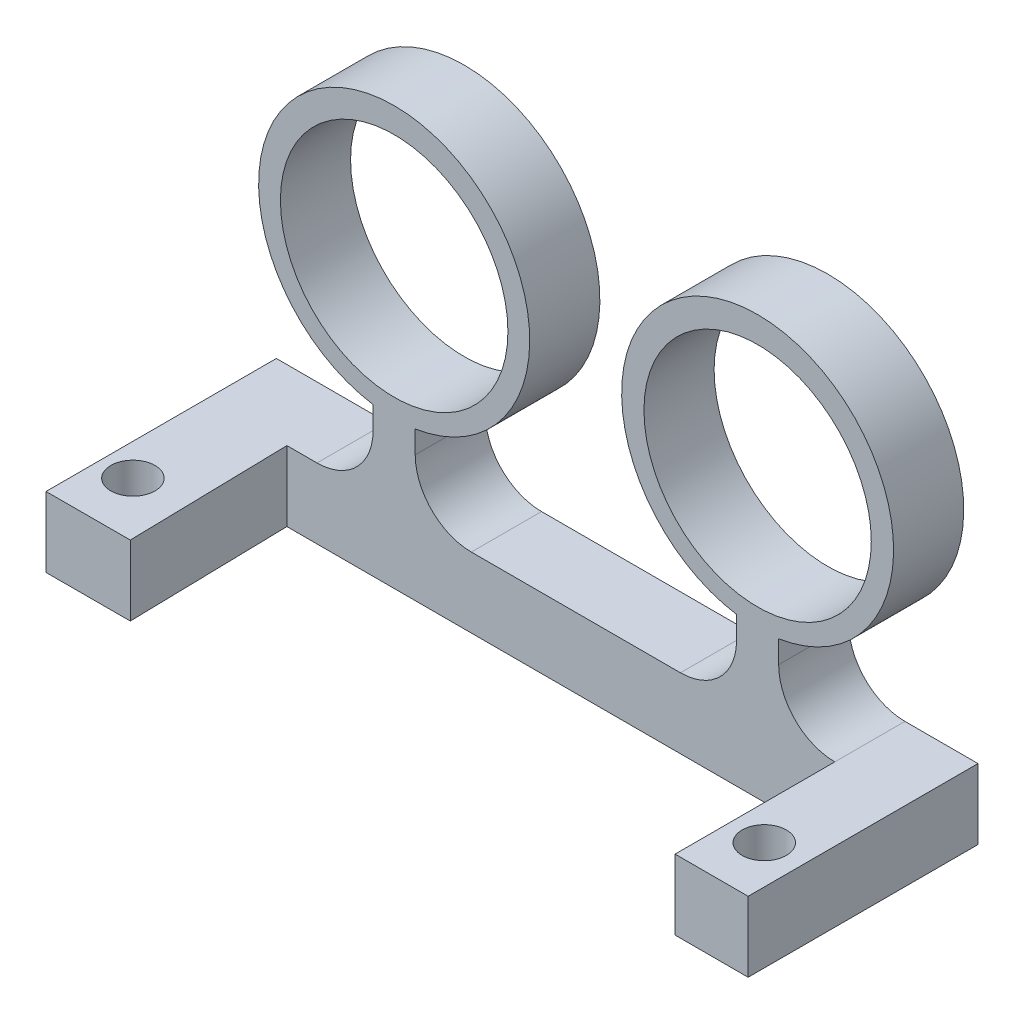
ISO-10303-21;
HEADER;
FILE_DESCRIPTION(('STEP AP214'),'2;1');
FILE_NAME('part.step','',(''),(''),'','','');
FILE_SCHEMA(('AUTOMOTIVE_DESIGN { 1 0 10303 214 1 1 1 1 }'));
ENDSEC;
DATA;
#1=APPLICATION_CONTEXT('core data for automotive mechanical design processes');
#2=APPLICATION_PROTOCOL_DEFINITION('international standard','automotive_design',2000,#1);
#3=PRODUCT_CONTEXT('',#1,'mechanical');
#4=PRODUCT('Part','Part','',(#3));
#5=PRODUCT_RELATED_PRODUCT_CATEGORY('part','',(#4));
#6=PRODUCT_DEFINITION_FORMATION('','',#4);
#7=PRODUCT_DEFINITION_CONTEXT('part definition',#1,'design');
#8=PRODUCT_DEFINITION('design','',#6,#7);
#9=PRODUCT_DEFINITION_SHAPE('','',#8);
#10=(LENGTH_UNIT() NAMED_UNIT(*) SI_UNIT(.MILLI.,.METRE.));
#11=(NAMED_UNIT(*) PLANE_ANGLE_UNIT() SI_UNIT($,.RADIAN.));
#12=(NAMED_UNIT(*) SI_UNIT($,.STERADIAN.) SOLID_ANGLE_UNIT());
#13=UNCERTAINTY_MEASURE_WITH_UNIT(LENGTH_MEASURE(1.E-05),#10,'distance_accuracy_value','');
#14=(GEOMETRIC_REPRESENTATION_CONTEXT(3) GLOBAL_UNCERTAINTY_ASSIGNED_CONTEXT((#13)) GLOBAL_UNIT_ASSIGNED_CONTEXT((#10,
#11,#12)) REPRESENTATION_CONTEXT('',''));
#15=CARTESIAN_POINT('',(0.,0.,0.));
#16=DIRECTION('',(0.,0.,1.));
#17=DIRECTION('',(1.,0.,0.));
#18=AXIS2_PLACEMENT_3D('',#15,#16,#17);
#19=CARTESIAN_POINT('',(13.3947315880938,20.1428791681746,5.));
#20=DIRECTION('',(0.,0.,-1.));
#21=DIRECTION('',(-1.,0.,0.));
#22=AXIS2_PLACEMENT_3D('',#19,#20,#21);
#23=PLANE('',#22);
#24=DIRECTION('',(1.,0.,0.));
#25=VECTOR('',#24,1.);
#26=CARTESIAN_POINT('',(0.,0.,5.));
#27=LINE('',#26,#25);
#28=CARTESIAN_POINT('',(5.75200352373025,0.,5.));
#29=VERTEX_POINT('',#28);
#30=CARTESIAN_POINT('',(44.7947315880938,0.,5.));
#31=VERTEX_POINT('',#30);
#32=EDGE_CURVE('E52',#29,#31,#27,.T.);
#33=ORIENTED_EDGE('',*,*,#32,.T.);
#34=DIRECTION('',(0.,1.,0.));
#35=VECTOR('',#34,1.);
#36=CARTESIAN_POINT('',(44.7947315880938,20.1428791681746,5.));
#37=LINE('',#36,#35);
#38=CARTESIAN_POINT('',(44.7947315880938,5.,5.));
#39=VERTEX_POINT('',#38);
#40=EDGE_CURVE('E201',#31,#39,#37,.T.);
#41=ORIENTED_EDGE('',*,*,#40,.T.);
#42=CARTESIAN_POINT('',(44.7947315880938,9.,5.));
#43=DIRECTION('',(0.,0.,-1.));
#44=DIRECTION('',(-1.,0.,0.));
#45=AXIS2_PLACEMENT_3D('',#42,#43,#44);
#46=CIRCLE('',#45,4.);
#47=CARTESIAN_POINT('',(40.7947315880938,9.,5.));
#48=VERTEX_POINT('',#47);
#49=EDGE_CURVE('E11',#39,#48,#46,.T.);
#50=ORIENTED_EDGE('',*,*,#49,.T.);
#51=DIRECTION('',(0.,1.,0.));
#52=VECTOR('',#51,1.);
#53=CARTESIAN_POINT('',(40.7947315880938,5.,5.));
#54=LINE('',#53,#52);
#55=CARTESIAN_POINT('',(40.7947315880938,10.6,5.));
#56=VERTEX_POINT('',#55);
#57=EDGE_CURVE('E240',#48,#56,#54,.T.);
#58=ORIENTED_EDGE('',*,*,#57,.T.);
#59=CARTESIAN_POINT('',(39.2947315880938,20.1715707020491,5.));
#60=DIRECTION('',(0.,0.,1.));
#61=DIRECTION('',(-1.,0.,0.));
#62=AXIS2_PLACEMENT_3D('',#59,#60,#61);
#63=CIRCLE('',#62,9.68839335);
#64=CARTESIAN_POINT('',(37.7947315880938,10.6,5.));
#65=VERTEX_POINT('',#64);
#66=EDGE_CURVE('E243',#56,#65,#63,.T.);
#67=ORIENTED_EDGE('',*,*,#66,.T.);
#68=DIRECTION('',(0.,-1.,0.));
#69=VECTOR('',#68,1.);
#70=CARTESIAN_POINT('',(37.7947315880938,5.,5.));
#71=LINE('',#70,#69);
#72=CARTESIAN_POINT('',(37.7947315880938,9.,5.));
#73=VERTEX_POINT('',#72);
#74=EDGE_CURVE('E245',#65,#73,#71,.T.);
#75=ORIENTED_EDGE('',*,*,#74,.T.);
#76=CARTESIAN_POINT('',(33.7947315880938,9.,5.));
#77=DIRECTION('',(0.,0.,-1.));
#78=DIRECTION('',(-1.,0.,0.));
#79=AXIS2_PLACEMENT_3D('',#76,#77,#78);
#80=CIRCLE('',#79,4.);
#81=CARTESIAN_POINT('',(33.7947315880938,5.,5.));
#82=VERTEX_POINT('',#81);
#83=EDGE_CURVE('E333',#73,#82,#80,.T.);
#84=ORIENTED_EDGE('',*,*,#83,.T.);
#85=DIRECTION('',(-1.,0.,0.));
#86=VECTOR('',#85,1.);
#87=CARTESIAN_POINT('',(37.7947315880938,5.,5.));
#88=LINE('',#87,#86);
#89=CARTESIAN_POINT('',(18.8947315880938,5.,5.));
#90=VERTEX_POINT('',#89);
#91=EDGE_CURVE('E248',#82,#90,#88,.T.);
#92=ORIENTED_EDGE('',*,*,#91,.T.);
#93=CARTESIAN_POINT('',(18.8947315880938,9.,5.));
#94=DIRECTION('',(0.,0.,-1.));
#95=DIRECTION('',(-1.,0.,0.));
#96=AXIS2_PLACEMENT_3D('',#93,#94,#95);
#97=CIRCLE('',#96,4.);
#98=CARTESIAN_POINT('',(14.8947315880938,9.,5.));
#99=VERTEX_POINT('',#98);
#100=EDGE_CURVE('E329',#90,#99,#97,.T.);
#101=ORIENTED_EDGE('',*,*,#100,.T.);
#102=DIRECTION('',(0.,1.,0.));
#103=VECTOR('',#102,1.);
#104=CARTESIAN_POINT('',(14.8947315880938,5.,5.));
#105=LINE('',#104,#103);
#106=CARTESIAN_POINT('',(14.8947315880938,10.6,5.));
#107=VERTEX_POINT('',#106);
#108=EDGE_CURVE('E251',#99,#107,#105,.T.);
#109=ORIENTED_EDGE('',*,*,#108,.T.);
#110=CARTESIAN_POINT('',(13.3947315880938,20.1428791681746,5.));
#111=DIRECTION('',(0.,0.,1.));
#112=DIRECTION('',(-1.,0.,0.));
#113=AXIS2_PLACEMENT_3D('',#110,#111,#112);
#114=CIRCLE('',#113,9.6600488);
#115=CARTESIAN_POINT('',(11.8947315880938,10.6,5.));
#116=VERTEX_POINT('',#115);
#117=EDGE_CURVE('E253',#107,#116,#114,.T.);
#118=ORIENTED_EDGE('',*,*,#117,.T.);
#119=DIRECTION('',(0.,-1.,0.));
#120=VECTOR('',#119,1.);
#121=CARTESIAN_POINT('',(11.8947315880938,5.,5.));
#122=LINE('',#121,#120);
#123=CARTESIAN_POINT('',(11.8947315880938,9.,5.));
#124=VERTEX_POINT('',#123);
#125=EDGE_CURVE('E255',#116,#124,#122,.T.);
#126=ORIENTED_EDGE('',*,*,#125,.T.);
#127=CARTESIAN_POINT('',(7.89473158809378,9.,5.));
#128=DIRECTION('',(0.,0.,-1.));
#129=DIRECTION('',(-1.,0.,0.));
#130=AXIS2_PLACEMENT_3D('',#127,#128,#129);
#131=CIRCLE('',#130,4.);
#132=CARTESIAN_POINT('',(7.89473158809378,5.,5.));
#133=VERTEX_POINT('',#132);
#134=EDGE_CURVE('E325',#124,#133,#131,.T.);
#135=ORIENTED_EDGE('',*,*,#134,.T.);
#136=DIRECTION('',(-1.,0.,0.));
#137=VECTOR('',#136,1.);
#138=CARTESIAN_POINT('',(0.,5.,5.));
#139=LINE('',#138,#137);
#140=CARTESIAN_POINT('',(5.75200352373025,5.,5.));
#141=VERTEX_POINT('',#140);
#142=EDGE_CURVE('E258',#133,#141,#139,.T.);
#143=ORIENTED_EDGE('',*,*,#142,.T.);
#144=DIRECTION('',(0.,-1.,0.));
#145=VECTOR('',#144,1.);
#146=CARTESIAN_POINT('',(5.75200352373025,20.1428791681746,5.));
#147=LINE('',#146,#145);
#148=EDGE_CURVE('E57',#141,#29,#147,.T.);
#149=ORIENTED_EDGE('',*,*,#148,.T.);
#150=EDGE_LOOP('',(#33,#41,#50,#58,#67,#75,#84,#92,#101,#109,#118,#126,#135,#143,#149));
#151=FACE_BOUND('',#150,.T.);
#152=CARTESIAN_POINT('',(13.3947315880938,19.9090963313926,5.));
#153=DIRECTION('',(0.,0.,1.));
#154=DIRECTION('',(1.,0.,0.));
#155=AXIS2_PLACEMENT_3D('',#152,#153,#154);
#156=CIRCLE('',#155,8.106403635);
#157=CARTESIAN_POINT('',(21.5011352230938,19.9090963313926,5.));
#158=VERTEX_POINT('',#157);
#159=EDGE_CURVE('E233',#158,#158,#156,.T.);
#160=ORIENTED_EDGE('',*,*,#159,.F.);
#161=EDGE_LOOP('',(#160));
#162=FACE_BOUND('',#161,.T.);
#163=CARTESIAN_POINT('',(39.2947315880938,19.9090963313926,5.));
#164=DIRECTION('',(0.,0.,1.));
#165=DIRECTION('',(1.,0.,0.));
#166=AXIS2_PLACEMENT_3D('',#163,#164,#165);
#167=CIRCLE('',#166,8.1);
#168=CARTESIAN_POINT('',(47.3947315880938,19.9090963313926,5.));
#169=VERTEX_POINT('',#168);
#170=EDGE_CURVE('E227',#169,#169,#167,.T.);
#171=ORIENTED_EDGE('',*,*,#170,.F.);
#172=EDGE_LOOP('',(#171));
#173=FACE_BOUND('',#172,.T.);
#174=ADVANCED_FACE('F37',(#151,#162,#173),#23,.F.);
#175=CARTESIAN_POINT('',(13.3947315880938,20.1428791681746,0.));
#176=DIRECTION('',(0.,0.,-1.));
#177=DIRECTION('',(-1.,0.,0.));
#178=AXIS2_PLACEMENT_3D('',#175,#176,#177);
#179=PLANE('',#178);
#180=CARTESIAN_POINT('',(44.7947315880938,9.,0.));
#181=DIRECTION('',(0.,0.,-1.));
#182=DIRECTION('',(-1.,0.,0.));
#183=AXIS2_PLACEMENT_3D('',#180,#181,#182);
#184=CIRCLE('',#183,4.);
#185=CARTESIAN_POINT('',(40.7947315880938,9.,0.));
#186=VERTEX_POINT('',#185);
#187=CARTESIAN_POINT('',(44.7947315880938,5.,0.));
#188=VERTEX_POINT('',#187);
#189=EDGE_CURVE('E45',#186,#188,#184,.F.);
#190=ORIENTED_EDGE('',*,*,#189,.T.);
#191=DIRECTION('',(-1.,0.,0.));
#192=VECTOR('',#191,1.);
#193=CARTESIAN_POINT('',(50.,5.,0.));
#194=LINE('',#193,#192);
#195=CARTESIAN_POINT('',(50.,5.,0.));
#196=VERTEX_POINT('',#195);
#197=EDGE_CURVE('E266',#196,#188,#194,.T.);
#198=ORIENTED_EDGE('',*,*,#197,.F.);
#199=DIRECTION('',(0.,1.,0.));
#200=VECTOR('',#199,1.);
#201=CARTESIAN_POINT('',(50.,0.,0.));
#202=LINE('',#201,#200);
#203=CARTESIAN_POINT('',(50.,0.,0.));
#204=VERTEX_POINT('',#203);
#205=EDGE_CURVE('E176',#204,#196,#202,.T.);
#206=ORIENTED_EDGE('',*,*,#205,.F.);
#207=DIRECTION('',(1.,0.,0.));
#208=VECTOR('',#207,1.);
#209=CARTESIAN_POINT('',(0.,0.,0.));
#210=LINE('',#209,#208);
#211=CARTESIAN_POINT('',(0.,0.,0.));
#212=VERTEX_POINT('',#211);
#213=EDGE_CURVE('E263',#212,#204,#210,.T.);
#214=ORIENTED_EDGE('',*,*,#213,.F.);
#215=DIRECTION('',(0.,-1.,0.));
#216=VECTOR('',#215,1.);
#217=CARTESIAN_POINT('',(0.,0.,0.));
#218=LINE('',#217,#216);
#219=CARTESIAN_POINT('',(0.,5.,0.));
#220=VERTEX_POINT('',#219);
#221=EDGE_CURVE('E236',#220,#212,#218,.T.);
#222=ORIENTED_EDGE('',*,*,#221,.F.);
#223=DIRECTION('',(-1.,0.,0.));
#224=VECTOR('',#223,1.);
#225=CARTESIAN_POINT('',(0.,5.,0.));
#226=LINE('',#225,#224);
#227=CARTESIAN_POINT('',(7.89473158809378,5.,0.));
#228=VERTEX_POINT('',#227);
#229=EDGE_CURVE('E241',#228,#220,#226,.T.);
#230=ORIENTED_EDGE('',*,*,#229,.F.);
#231=CARTESIAN_POINT('',(7.89473158809378,9.,0.));
#232=DIRECTION('',(0.,0.,-1.));
#233=DIRECTION('',(-1.,0.,0.));
#234=AXIS2_PLACEMENT_3D('',#231,#232,#233);
#235=CIRCLE('',#234,4.);
#236=CARTESIAN_POINT('',(11.8947315880938,9.,0.));
#237=VERTEX_POINT('',#236);
#238=EDGE_CURVE('E323',#228,#237,#235,.F.);
#239=ORIENTED_EDGE('',*,*,#238,.T.);
#240=DIRECTION('',(0.,-1.,0.));
#241=VECTOR('',#240,1.);
#242=CARTESIAN_POINT('',(11.8947315880938,5.,0.));
#243=LINE('',#242,#241);
#244=CARTESIAN_POINT('',(11.8947315880938,10.6,0.));
#245=VERTEX_POINT('',#244);
#246=EDGE_CURVE('E282',#245,#237,#243,.T.);
#247=ORIENTED_EDGE('',*,*,#246,.F.);
#248=CARTESIAN_POINT('',(13.3947315880938,20.1428791681746,0.));
#249=DIRECTION('',(0.,0.,1.));
#250=DIRECTION('',(-1.,0.,0.));
#251=AXIS2_PLACEMENT_3D('',#248,#249,#250);
#252=CIRCLE('',#251,9.6600488);
#253=CARTESIAN_POINT('',(14.8947315880938,10.6,0.));
#254=VERTEX_POINT('',#253);
#255=EDGE_CURVE('E280',#254,#245,#252,.T.);
#256=ORIENTED_EDGE('',*,*,#255,.F.);
#257=DIRECTION('',(0.,1.,0.));
#258=VECTOR('',#257,1.);
#259=CARTESIAN_POINT('',(14.8947315880938,5.,0.));
#260=LINE('',#259,#258);
#261=CARTESIAN_POINT('',(14.8947315880938,9.,0.));
#262=VERTEX_POINT('',#261);
#263=EDGE_CURVE('E278',#262,#254,#260,.T.);
#264=ORIENTED_EDGE('',*,*,#263,.F.);
#265=CARTESIAN_POINT('',(18.8947315880938,9.,0.));
#266=DIRECTION('',(0.,0.,-1.));
#267=DIRECTION('',(-1.,0.,0.));
#268=AXIS2_PLACEMENT_3D('',#265,#266,#267);
#269=CIRCLE('',#268,4.);
#270=CARTESIAN_POINT('',(18.8947315880938,5.,0.));
#271=VERTEX_POINT('',#270);
#272=EDGE_CURVE('E327',#262,#271,#269,.F.);
#273=ORIENTED_EDGE('',*,*,#272,.T.);
#274=DIRECTION('',(-1.,0.,0.));
#275=VECTOR('',#274,1.);
#276=CARTESIAN_POINT('',(37.7947315880938,5.,0.));
#277=LINE('',#276,#275);
#278=CARTESIAN_POINT('',(33.7947315880938,5.,0.));
#279=VERTEX_POINT('',#278);
#280=EDGE_CURVE('E275',#279,#271,#277,.T.);
#281=ORIENTED_EDGE('',*,*,#280,.F.);
#282=CARTESIAN_POINT('',(33.7947315880938,9.,0.));
#283=DIRECTION('',(0.,0.,-1.));
#284=DIRECTION('',(-1.,0.,0.));
#285=AXIS2_PLACEMENT_3D('',#282,#283,#284);
#286=CIRCLE('',#285,4.);
#287=CARTESIAN_POINT('',(37.7947315880938,9.,0.));
#288=VERTEX_POINT('',#287);
#289=EDGE_CURVE('E331',#279,#288,#286,.F.);
#290=ORIENTED_EDGE('',*,*,#289,.T.);
#291=DIRECTION('',(0.,-1.,0.));
#292=VECTOR('',#291,1.);
#293=CARTESIAN_POINT('',(37.7947315880938,5.,0.));
#294=LINE('',#293,#292);
#295=CARTESIAN_POINT('',(37.7947315880938,10.6,0.));
#296=VERTEX_POINT('',#295);
#297=EDGE_CURVE('E272',#296,#288,#294,.T.);
#298=ORIENTED_EDGE('',*,*,#297,.F.);
#299=CARTESIAN_POINT('',(39.2947315880938,20.1715707020491,0.));
#300=DIRECTION('',(0.,0.,1.));
#301=DIRECTION('',(-1.,0.,0.));
#302=AXIS2_PLACEMENT_3D('',#299,#300,#301);
#303=CIRCLE('',#302,9.68839335);
#304=CARTESIAN_POINT('',(40.7947315880938,10.6,0.));
#305=VERTEX_POINT('',#304);
#306=EDGE_CURVE('E270',#305,#296,#303,.T.);
#307=ORIENTED_EDGE('',*,*,#306,.F.);
#308=DIRECTION('',(0.,1.,0.));
#309=VECTOR('',#308,1.);
#310=CARTESIAN_POINT('',(40.7947315880938,5.,0.));
#311=LINE('',#310,#309);
#312=EDGE_CURVE('E268',#186,#305,#311,.T.);
#313=ORIENTED_EDGE('',*,*,#312,.F.);
#314=EDGE_LOOP('',(#190,#198,#206,#214,#222,#230,#239,#247,#256,#264,#273,#281,#290,#298,#307,#313));
#315=FACE_BOUND('',#314,.T.);
#316=CARTESIAN_POINT('',(13.3947315880938,19.9090963313926,0.));
#317=DIRECTION('',(0.,0.,1.));
#318=DIRECTION('',(1.,0.,0.));
#319=AXIS2_PLACEMENT_3D('',#316,#317,#318);
#320=CIRCLE('',#319,8.106403635);
#321=CARTESIAN_POINT('',(21.5011352230938,19.9090963313926,0.));
#322=VERTEX_POINT('',#321);
#323=EDGE_CURVE('E230',#322,#322,#320,.T.);
#324=ORIENTED_EDGE('',*,*,#323,.T.);
#325=EDGE_LOOP('',(#324));
#326=FACE_BOUND('',#325,.T.);
#327=CARTESIAN_POINT('',(39.2947315880938,19.9090963313926,0.));
#328=DIRECTION('',(0.,0.,1.));
#329=DIRECTION('',(1.,0.,0.));
#330=AXIS2_PLACEMENT_3D('',#327,#328,#329);
#331=CIRCLE('',#330,8.1);
#332=CARTESIAN_POINT('',(47.3947315880938,19.9090963313926,0.));
#333=VERTEX_POINT('',#332);
#334=EDGE_CURVE('E226',#333,#333,#331,.T.);
#335=ORIENTED_EDGE('',*,*,#334,.T.);
#336=EDGE_LOOP('',(#335));
#337=FACE_BOUND('',#336,.T.);
#338=ADVANCED_FACE('F336',(#315,#326,#337),#179,.T.);
#339=CARTESIAN_POINT('',(0.,0.,5.));
#340=DIRECTION('',(1.,0.,0.));
#341=DIRECTION('',(0.,0.,-1.));
#342=AXIS2_PLACEMENT_3D('',#339,#340,#341);
#343=PLANE('',#342);
#344=ORIENTED_EDGE('',*,*,#221,.T.);
#345=DIRECTION('',(0.,0.,-1.));
#346=VECTOR('',#345,1.);
#347=CARTESIAN_POINT('',(0.,0.,5.));
#348=LINE('',#347,#346);
#349=CARTESIAN_POINT('',(0.,0.,16.4162337159774));
#350=VERTEX_POINT('',#349);
#351=EDGE_CURVE('E300',#350,#212,#348,.T.);
#352=ORIENTED_EDGE('',*,*,#351,.F.);
#353=DIRECTION('',(0.,1.,0.));
#354=VECTOR('',#353,1.);
#355=CARTESIAN_POINT('',(0.,0.,16.4162337159774));
#356=LINE('',#355,#354);
#357=CARTESIAN_POINT('',(0.,5.,16.4162337159774));
#358=VERTEX_POINT('',#357);
#359=EDGE_CURVE('E216',#350,#358,#356,.T.);
#360=ORIENTED_EDGE('',*,*,#359,.T.);
#361=DIRECTION('',(0.,0.,-1.));
#362=VECTOR('',#361,1.);
#363=CARTESIAN_POINT('',(0.,5.,5.));
#364=LINE('',#363,#362);
#365=EDGE_CURVE('E260',#358,#220,#364,.T.);
#366=ORIENTED_EDGE('',*,*,#365,.T.);
#367=EDGE_LOOP('',(#344,#352,#360,#366));
#368=FACE_BOUND('',#367,.T.);
#369=ADVANCED_FACE('F404',(#368),#343,.F.);
#370=CARTESIAN_POINT('',(0.,0.,5.));
#371=DIRECTION('',(0.,1.,0.));
#372=DIRECTION('',(0.,0.,1.));
#373=AXIS2_PLACEMENT_3D('',#370,#371,#372);
#374=PLANE('',#373);
#375=CARTESIAN_POINT('',(2.27680394903786,0.,12.5));
#376=DIRECTION('',(0.,1.,0.));
#377=DIRECTION('',(-1.,0.,0.));
#378=AXIS2_PLACEMENT_3D('',#375,#376,#377);
#379=CIRCLE('',#378,1.57541997281081);
#380=CARTESIAN_POINT('',(0.70138397622705,0.,12.5));
#381=VERTEX_POINT('',#380);
#382=EDGE_CURVE('E192',#381,#381,#379,.T.);
#383=ORIENTED_EDGE('',*,*,#382,.T.);
#384=EDGE_LOOP('',(#383));
#385=FACE_BOUND('',#384,.T.);
#386=CARTESIAN_POINT('',(47.267044879811,0.,12.5));
#387=DIRECTION('',(0.,1.,0.));
#388=DIRECTION('',(-1.,0.,0.));
#389=AXIS2_PLACEMENT_3D('',#386,#387,#388);
#390=CIRCLE('',#389,1.5754199728108);
#391=CARTESIAN_POINT('',(45.6916249070002,0.,12.5));
#392=VERTEX_POINT('',#391);
#393=EDGE_CURVE('E409',#392,#392,#390,.T.);
#394=ORIENTED_EDGE('',*,*,#393,.T.);
#395=EDGE_LOOP('',(#394));
#396=FACE_BOUND('',#395,.T.);
#397=ORIENTED_EDGE('',*,*,#213,.T.);
#398=DIRECTION('',(0.,0.,-1.));
#399=VECTOR('',#398,1.);
#400=CARTESIAN_POINT('',(50.,0.,5.));
#401=LINE('',#400,#399);
#402=CARTESIAN_POINT('',(50.,0.,16.3808522098918));
#403=VERTEX_POINT('',#402);
#404=EDGE_CURVE('E181',#403,#204,#401,.T.);
#405=ORIENTED_EDGE('',*,*,#404,.F.);
#406=DIRECTION('',(1.,0.,0.));
#407=VECTOR('',#406,1.);
#408=CARTESIAN_POINT('',(44.7947315880938,0.,16.3808522098918));
#409=LINE('',#408,#407);
#410=CARTESIAN_POINT('',(44.7947315880938,0.,16.3808522098918));
#411=VERTEX_POINT('',#410);
#412=EDGE_CURVE('E190',#411,#403,#409,.T.);
#413=ORIENTED_EDGE('',*,*,#412,.F.);
#414=DIRECTION('',(0.,0.,1.));
#415=VECTOR('',#414,1.);
#416=CARTESIAN_POINT('',(44.7947315880938,0.,0.));
#417=LINE('',#416,#415);
#418=EDGE_CURVE('E199',#31,#411,#417,.T.);
#419=ORIENTED_EDGE('',*,*,#418,.F.);
#420=ORIENTED_EDGE('',*,*,#32,.F.);
#421=DIRECTION('',(-0.0218433574000515,0.,-0.999761405405057));
#422=VECTOR('',#421,1.);
#423=CARTESIAN_POINT('',(5.64276067197603,0.,0.));
#424=LINE('',#423,#422);
#425=CARTESIAN_POINT('',(6.00131496901593,0.,16.410881411563));
#426=VERTEX_POINT('',#425);
#427=EDGE_CURVE('E209',#426,#29,#424,.T.);
#428=ORIENTED_EDGE('',*,*,#427,.F.);
#429=DIRECTION('',(0.999999602297321,0.,-0.000891854920702434));
#430=VECTOR('',#429,1.);
#431=CARTESIAN_POINT('',(6.00131496901593,0.,16.410881411563));
#432=LINE('',#431,#430);
#433=EDGE_CURVE('E212',#350,#426,#432,.T.);
#434=ORIENTED_EDGE('',*,*,#433,.F.);
#435=ORIENTED_EDGE('',*,*,#351,.T.);
#436=EDGE_LOOP('',(#397,#405,#413,#419,#420,#428,#434,#435));
#437=FACE_BOUND('',#436,.T.);
#438=ADVANCED_FACE('F398',(#385,#396,#437),#374,.F.);
#439=CARTESIAN_POINT('',(50.,0.,5.));
#440=DIRECTION('',(-1.,0.,0.));
#441=DIRECTION('',(0.,0.,1.));
#442=AXIS2_PLACEMENT_3D('',#439,#440,#441);
#443=PLANE('',#442);
#444=ORIENTED_EDGE('',*,*,#205,.T.);
#445=DIRECTION('',(0.,0.,-1.));
#446=VECTOR('',#445,1.);
#447=CARTESIAN_POINT('',(50.,5.,5.));
#448=LINE('',#447,#446);
#449=CARTESIAN_POINT('',(50.,5.,16.3808522098918));
#450=VERTEX_POINT('',#449);
#451=EDGE_CURVE('E169',#450,#196,#448,.T.);
#452=ORIENTED_EDGE('',*,*,#451,.F.);
#453=DIRECTION('',(0.,1.,0.));
#454=VECTOR('',#453,1.);
#455=CARTESIAN_POINT('',(50.,0.,16.3808522098918));
#456=LINE('',#455,#454);
#457=EDGE_CURVE('E173',#403,#450,#456,.T.);
#458=ORIENTED_EDGE('',*,*,#457,.F.);
#459=ORIENTED_EDGE('',*,*,#404,.T.);
#460=EDGE_LOOP('',(#444,#452,#458,#459));
#461=FACE_BOUND('',#460,.T.);
#462=ADVANCED_FACE('F171',(#461),#443,.F.);
#463=CARTESIAN_POINT('',(50.,5.,5.));
#464=DIRECTION('',(0.,-1.,0.));
#465=DIRECTION('',(1.,0.,0.));
#466=AXIS2_PLACEMENT_3D('',#463,#464,#465);
#467=PLANE('',#466);
#468=CARTESIAN_POINT('',(47.267044879811,5.,12.5));
#469=DIRECTION('',(0.,1.,0.));
#470=DIRECTION('',(-1.,0.,0.));
#471=AXIS2_PLACEMENT_3D('',#468,#469,#470);
#472=CIRCLE('',#471,1.5754199728108);
#473=CARTESIAN_POINT('',(45.6916249070002,5.,12.5));
#474=VERTEX_POINT('',#473);
#475=EDGE_CURVE('E412',#474,#474,#472,.T.);
#476=ORIENTED_EDGE('',*,*,#475,.F.);
#477=EDGE_LOOP('',(#476));
#478=FACE_BOUND('',#477,.T.);
#479=ORIENTED_EDGE('',*,*,#197,.T.);
#480=DIRECTION('',(0.,0.,-1.));
#481=VECTOR('',#480,1.);
#482=CARTESIAN_POINT('',(44.7947315880938,5.,5.));
#483=LINE('',#482,#481);
#484=EDGE_CURVE('E321',#188,#39,#483,.F.);
#485=ORIENTED_EDGE('',*,*,#484,.T.);
#486=DIRECTION('',(0.,0.,1.));
#487=VECTOR('',#486,1.);
#488=CARTESIAN_POINT('',(44.7947315880938,5.,0.));
#489=LINE('',#488,#487);
#490=CARTESIAN_POINT('',(44.7947315880938,5.,16.3808522098918));
#491=VERTEX_POINT('',#490);
#492=EDGE_CURVE('E197',#39,#491,#489,.T.);
#493=ORIENTED_EDGE('',*,*,#492,.T.);
#494=DIRECTION('',(1.,0.,0.));
#495=VECTOR('',#494,1.);
#496=CARTESIAN_POINT('',(44.7947315880938,5.,16.3808522098918));
#497=LINE('',#496,#495);
#498=EDGE_CURVE('E188',#491,#450,#497,.T.);
#499=ORIENTED_EDGE('',*,*,#498,.T.);
#500=ORIENTED_EDGE('',*,*,#451,.T.);
#501=EDGE_LOOP('',(#479,#485,#493,#499,#500));
#502=FACE_BOUND('',#501,.T.);
#503=ADVANCED_FACE('F194',(#478,#502),#467,.F.);
#504=CARTESIAN_POINT('',(40.7947315880938,5.,5.));
#505=DIRECTION('',(-1.,0.,0.));
#506=DIRECTION('',(0.,0.,1.));
#507=AXIS2_PLACEMENT_3D('',#504,#505,#506);
#508=PLANE('',#507);
#509=ORIENTED_EDGE('',*,*,#57,.F.);
#510=DIRECTION('',(0.,0.,-1.));
#511=VECTOR('',#510,1.);
#512=CARTESIAN_POINT('',(40.7947315880938,9.,0.));
#513=LINE('',#512,#511);
#514=EDGE_CURVE('E318',#48,#186,#513,.T.);
#515=ORIENTED_EDGE('',*,*,#514,.T.);
#516=ORIENTED_EDGE('',*,*,#312,.T.);
#517=DIRECTION('',(0.,0.,-1.));
#518=VECTOR('',#517,1.);
#519=CARTESIAN_POINT('',(40.7947315880938,10.6,5.));
#520=LINE('',#519,#518);
#521=EDGE_CURVE('E182',#56,#305,#520,.T.);
#522=ORIENTED_EDGE('',*,*,#521,.F.);
#523=EDGE_LOOP('',(#509,#515,#516,#522));
#524=FACE_BOUND('',#523,.T.);
#525=ADVANCED_FACE('F346',(#524),#508,.F.);
#526=CARTESIAN_POINT('',(39.2947315880938,20.1715707020491,5.));
#527=DIRECTION('',(0.,0.,-1.));
#528=DIRECTION('',(-1.,0.,0.));
#529=AXIS2_PLACEMENT_3D('',#526,#527,#528);
#530=CYLINDRICAL_SURFACE('',#529,9.68839335);
#531=ORIENTED_EDGE('',*,*,#306,.T.);
#532=DIRECTION('',(0.,0.,-1.));
#533=VECTOR('',#532,1.);
#534=CARTESIAN_POINT('',(37.7947315880938,10.6,5.));
#535=LINE('',#534,#533);
#536=EDGE_CURVE('E294',#65,#296,#535,.T.);
#537=ORIENTED_EDGE('',*,*,#536,.F.);
#538=ORIENTED_EDGE('',*,*,#66,.F.);
#539=ORIENTED_EDGE('',*,*,#521,.T.);
#540=EDGE_LOOP('',(#531,#537,#538,#539));
#541=FACE_BOUND('',#540,.T.);
#542=ADVANCED_FACE('F350',(#541),#530,.T.);
#543=CARTESIAN_POINT('',(37.7947315880938,5.,5.));
#544=DIRECTION('',(1.,0.,0.));
#545=DIRECTION('',(0.,0.,-1.));
#546=AXIS2_PLACEMENT_3D('',#543,#544,#545);
#547=PLANE('',#546);
#548=ORIENTED_EDGE('',*,*,#297,.T.);
#549=DIRECTION('',(0.,0.,-1.));
#550=VECTOR('',#549,1.);
#551=CARTESIAN_POINT('',(37.7947315880938,9.,5.));
#552=LINE('',#551,#550);
#553=EDGE_CURVE('E316',#288,#73,#552,.F.);
#554=ORIENTED_EDGE('',*,*,#553,.T.);
#555=ORIENTED_EDGE('',*,*,#74,.F.);
#556=ORIENTED_EDGE('',*,*,#536,.T.);
#557=EDGE_LOOP('',(#548,#554,#555,#556));
#558=FACE_BOUND('',#557,.T.);
#559=ADVANCED_FACE('F608',(#558),#547,.F.);
#560=CARTESIAN_POINT('',(37.7947315880938,5.,5.));
#561=DIRECTION('',(0.,-1.,0.));
#562=DIRECTION('',(1.,0.,0.));
#563=AXIS2_PLACEMENT_3D('',#560,#561,#562);
#564=PLANE('',#563);
#565=ORIENTED_EDGE('',*,*,#280,.T.);
#566=DIRECTION('',(0.,0.,-1.));
#567=VECTOR('',#566,1.);
#568=CARTESIAN_POINT('',(18.8947315880938,5.,5.));
#569=LINE('',#568,#567);
#570=EDGE_CURVE('E314',#271,#90,#569,.F.);
#571=ORIENTED_EDGE('',*,*,#570,.T.);
#572=ORIENTED_EDGE('',*,*,#91,.F.);
#573=DIRECTION('',(0.,0.,-1.));
#574=VECTOR('',#573,1.);
#575=CARTESIAN_POINT('',(33.7947315880938,5.,0.));
#576=LINE('',#575,#574);
#577=EDGE_CURVE('E311',#82,#279,#576,.T.);
#578=ORIENTED_EDGE('',*,*,#577,.T.);
#579=EDGE_LOOP('',(#565,#571,#572,#578));
#580=FACE_BOUND('',#579,.T.);
#581=ADVANCED_FACE('F361',(#580),#564,.F.);
#582=CARTESIAN_POINT('',(14.8947315880938,5.,5.));
#583=DIRECTION('',(-1.,0.,0.));
#584=DIRECTION('',(0.,0.,1.));
#585=AXIS2_PLACEMENT_3D('',#582,#583,#584);
#586=PLANE('',#585);
#587=ORIENTED_EDGE('',*,*,#108,.F.);
#588=DIRECTION('',(0.,0.,-1.));
#589=VECTOR('',#588,1.);
#590=CARTESIAN_POINT('',(14.8947315880938,9.,0.));
#591=LINE('',#590,#589);
#592=EDGE_CURVE('E308',#99,#262,#591,.T.);
#593=ORIENTED_EDGE('',*,*,#592,.T.);
#594=ORIENTED_EDGE('',*,*,#263,.T.);
#595=DIRECTION('',(0.,0.,-1.));
#596=VECTOR('',#595,1.);
#597=CARTESIAN_POINT('',(14.8947315880938,10.6,5.));
#598=LINE('',#597,#596);
#599=EDGE_CURVE('E291',#107,#254,#598,.T.);
#600=ORIENTED_EDGE('',*,*,#599,.F.);
#601=EDGE_LOOP('',(#587,#593,#594,#600));
#602=FACE_BOUND('',#601,.T.);
#603=ADVANCED_FACE('F372',(#602),#586,.F.);
#604=CARTESIAN_POINT('',(13.3947315880938,20.1428791681746,5.));
#605=DIRECTION('',(0.,0.,-1.));
#606=DIRECTION('',(-1.,0.,0.));
#607=AXIS2_PLACEMENT_3D('',#604,#605,#606);
#608=CYLINDRICAL_SURFACE('',#607,9.6600488);
#609=ORIENTED_EDGE('',*,*,#255,.T.);
#610=DIRECTION('',(0.,0.,-1.));
#611=VECTOR('',#610,1.);
#612=CARTESIAN_POINT('',(11.8947315880938,10.6,5.));
#613=LINE('',#612,#611);
#614=EDGE_CURVE('E288',#116,#245,#613,.T.);
#615=ORIENTED_EDGE('',*,*,#614,.F.);
#616=ORIENTED_EDGE('',*,*,#117,.F.);
#617=ORIENTED_EDGE('',*,*,#599,.T.);
#618=EDGE_LOOP('',(#609,#615,#616,#617));
#619=FACE_BOUND('',#618,.T.);
#620=ADVANCED_FACE('F379',(#619),#608,.T.);
#621=CARTESIAN_POINT('',(11.8947315880938,5.,5.));
#622=DIRECTION('',(1.,0.,0.));
#623=DIRECTION('',(0.,0.,-1.));
#624=AXIS2_PLACEMENT_3D('',#621,#622,#623);
#625=PLANE('',#624);
#626=ORIENTED_EDGE('',*,*,#246,.T.);
#627=DIRECTION('',(0.,0.,-1.));
#628=VECTOR('',#627,1.);
#629=CARTESIAN_POINT('',(11.8947315880938,9.,5.));
#630=LINE('',#629,#628);
#631=EDGE_CURVE('E306',#237,#124,#630,.F.);
#632=ORIENTED_EDGE('',*,*,#631,.T.);
#633=ORIENTED_EDGE('',*,*,#125,.F.);
#634=ORIENTED_EDGE('',*,*,#614,.T.);
#635=EDGE_LOOP('',(#626,#632,#633,#634));
#636=FACE_BOUND('',#635,.T.);
#637=ADVANCED_FACE('F382',(#636),#625,.F.);
#638=CARTESIAN_POINT('',(0.,5.,5.));
#639=DIRECTION('',(0.,-1.,0.));
#640=DIRECTION('',(1.,0.,0.));
#641=AXIS2_PLACEMENT_3D('',#638,#639,#640);
#642=PLANE('',#641);
#643=CARTESIAN_POINT('',(2.27680394903786,5.,12.5));
#644=DIRECTION('',(0.,1.,0.));
#645=DIRECTION('',(-1.,0.,0.));
#646=AXIS2_PLACEMENT_3D('',#643,#644,#645);
#647=CIRCLE('',#646,1.57541997281081);
#648=CARTESIAN_POINT('',(0.70138397622705,5.,12.5));
#649=VERTEX_POINT('',#648);
#650=EDGE_CURVE('E415',#649,#649,#647,.T.);
#651=ORIENTED_EDGE('',*,*,#650,.F.);
#652=EDGE_LOOP('',(#651));
#653=FACE_BOUND('',#652,.T.);
#654=ORIENTED_EDGE('',*,*,#229,.T.);
#655=ORIENTED_EDGE('',*,*,#365,.F.);
#656=DIRECTION('',(0.999999602297321,0.,-0.000891854920702434));
#657=VECTOR('',#656,1.);
#658=CARTESIAN_POINT('',(6.00131496901593,5.,16.410881411563));
#659=LINE('',#658,#657);
#660=CARTESIAN_POINT('',(6.00131496901593,5.,16.410881411563));
#661=VERTEX_POINT('',#660);
#662=EDGE_CURVE('E213',#358,#661,#659,.T.);
#663=ORIENTED_EDGE('',*,*,#662,.T.);
#664=DIRECTION('',(-0.0218433574000515,0.,-0.999761405405057));
#665=VECTOR('',#664,1.);
#666=CARTESIAN_POINT('',(5.64276067197603,5.,0.));
#667=LINE('',#666,#665);
#668=EDGE_CURVE('E208',#661,#141,#667,.T.);
#669=ORIENTED_EDGE('',*,*,#668,.T.);
#670=ORIENTED_EDGE('',*,*,#142,.F.);
#671=DIRECTION('',(0.,0.,-1.));
#672=VECTOR('',#671,1.);
#673=CARTESIAN_POINT('',(7.89473158809378,5.,0.));
#674=LINE('',#673,#672);
#675=EDGE_CURVE('E303',#133,#228,#674,.T.);
#676=ORIENTED_EDGE('',*,*,#675,.T.);
#677=EDGE_LOOP('',(#654,#655,#663,#669,#670,#676));
#678=FACE_BOUND('',#677,.T.);
#679=ADVANCED_FACE('F389',(#653,#678),#642,.F.);
#680=CARTESIAN_POINT('',(13.3947315880938,19.9090963313926,5.));
#681=DIRECTION('',(0.,0.,-1.));
#682=DIRECTION('',(-1.,0.,0.));
#683=AXIS2_PLACEMENT_3D('',#680,#681,#682);
#684=CYLINDRICAL_SURFACE('',#683,8.106403635);
#685=ORIENTED_EDGE('',*,*,#159,.T.);
#686=EDGE_LOOP('',(#685));
#687=FACE_BOUND('',#686,.T.);
#688=ORIENTED_EDGE('',*,*,#323,.F.);
#689=EDGE_LOOP('',(#688));
#690=FACE_BOUND('',#689,.T.);
#691=ADVANCED_FACE('F431',(#687,#690),#684,.F.);
#692=CARTESIAN_POINT('',(39.2947315880938,19.9090963313926,5.));
#693=DIRECTION('',(0.,0.,-1.));
#694=DIRECTION('',(-1.,0.,0.));
#695=AXIS2_PLACEMENT_3D('',#692,#693,#694);
#696=CYLINDRICAL_SURFACE('',#695,8.1);
#697=ORIENTED_EDGE('',*,*,#170,.T.);
#698=EDGE_LOOP('',(#697));
#699=FACE_BOUND('',#698,.T.);
#700=ORIENTED_EDGE('',*,*,#334,.F.);
#701=EDGE_LOOP('',(#700));
#702=FACE_BOUND('',#701,.T.);
#703=ADVANCED_FACE('F437',(#699,#702),#696,.F.);
#704=CARTESIAN_POINT('',(7.89473158809378,9.,5.));
#705=DIRECTION('',(0.,0.,1.));
#706=DIRECTION('',(1.,0.,0.));
#707=AXIS2_PLACEMENT_3D('',#704,#705,#706);
#708=CYLINDRICAL_SURFACE('',#707,4.);
#709=ORIENTED_EDGE('',*,*,#134,.F.);
#710=ORIENTED_EDGE('',*,*,#631,.F.);
#711=ORIENTED_EDGE('',*,*,#238,.F.);
#712=ORIENTED_EDGE('',*,*,#675,.F.);
#713=EDGE_LOOP('',(#709,#710,#711,#712));
#714=FACE_BOUND('',#713,.T.);
#715=ADVANCED_FACE('F385',(#714),#708,.F.);
#716=CARTESIAN_POINT('',(18.8947315880938,9.,5.));
#717=DIRECTION('',(0.,0.,1.));
#718=DIRECTION('',(1.,0.,0.));
#719=AXIS2_PLACEMENT_3D('',#716,#717,#718);
#720=CYLINDRICAL_SURFACE('',#719,4.);
#721=ORIENTED_EDGE('',*,*,#100,.F.);
#722=ORIENTED_EDGE('',*,*,#570,.F.);
#723=ORIENTED_EDGE('',*,*,#272,.F.);
#724=ORIENTED_EDGE('',*,*,#592,.F.);
#725=EDGE_LOOP('',(#721,#722,#723,#724));
#726=FACE_BOUND('',#725,.T.);
#727=ADVANCED_FACE('F369',(#726),#720,.F.);
#728=CARTESIAN_POINT('',(33.7947315880938,9.,5.));
#729=DIRECTION('',(0.,0.,1.));
#730=DIRECTION('',(1.,0.,0.));
#731=AXIS2_PLACEMENT_3D('',#728,#729,#730);
#732=CYLINDRICAL_SURFACE('',#731,4.);
#733=ORIENTED_EDGE('',*,*,#83,.F.);
#734=ORIENTED_EDGE('',*,*,#553,.F.);
#735=ORIENTED_EDGE('',*,*,#289,.F.);
#736=ORIENTED_EDGE('',*,*,#577,.F.);
#737=EDGE_LOOP('',(#733,#734,#735,#736));
#738=FACE_BOUND('',#737,.T.);
#739=ADVANCED_FACE('F358',(#738),#732,.F.);
#740=CARTESIAN_POINT('',(44.7947315880938,9.,5.));
#741=DIRECTION('',(0.,0.,1.));
#742=DIRECTION('',(1.,0.,0.));
#743=AXIS2_PLACEMENT_3D('',#740,#741,#742);
#744=CYLINDRICAL_SURFACE('',#743,4.);
#745=ORIENTED_EDGE('',*,*,#49,.F.);
#746=ORIENTED_EDGE('',*,*,#484,.F.);
#747=ORIENTED_EDGE('',*,*,#189,.F.);
#748=ORIENTED_EDGE('',*,*,#514,.F.);
#749=EDGE_LOOP('',(#745,#746,#747,#748));
#750=FACE_BOUND('',#749,.T.);
#751=ADVANCED_FACE('F39',(#750),#744,.F.);
#752=CARTESIAN_POINT('',(5.64276067197603,0.,0.));
#753=DIRECTION('',(0.999761405405056,0.,-0.0218433574000515));
#754=DIRECTION('',(-0.0218433574000515,0.,-0.999761405405057));
#755=AXIS2_PLACEMENT_3D('',#752,#753,#754);
#756=PLANE('',#755);
#757=ORIENTED_EDGE('',*,*,#148,.F.);
#758=ORIENTED_EDGE('',*,*,#668,.F.);
#759=DIRECTION('',(0.,1.,0.));
#760=VECTOR('',#759,1.);
#761=CARTESIAN_POINT('',(6.00131496901593,0.,16.410881411563));
#762=LINE('',#761,#760);
#763=EDGE_CURVE('E221',#426,#661,#762,.T.);
#764=ORIENTED_EDGE('',*,*,#763,.F.);
#765=ORIENTED_EDGE('',*,*,#427,.T.);
#766=EDGE_LOOP('',(#757,#758,#764,#765));
#767=FACE_BOUND('',#766,.T.);
#768=ADVANCED_FACE('F394',(#767),#756,.T.);
#769=CARTESIAN_POINT('',(6.00131496901593,0.,16.410881411563));
#770=DIRECTION('',(0.000891854920702434,0.,0.999999602297321));
#771=DIRECTION('',(0.999999602297321,0.,-0.000891854920702434));
#772=AXIS2_PLACEMENT_3D('',#769,#770,#771);
#773=PLANE('',#772);
#774=ORIENTED_EDGE('',*,*,#662,.F.);
#775=ORIENTED_EDGE('',*,*,#359,.F.);
#776=ORIENTED_EDGE('',*,*,#433,.T.);
#777=ORIENTED_EDGE('',*,*,#763,.T.);
#778=EDGE_LOOP('',(#774,#775,#776,#777));
#779=FACE_BOUND('',#778,.T.);
#780=ADVANCED_FACE('F402',(#779),#773,.T.);
#781=CARTESIAN_POINT('',(44.7947315880938,0.,0.));
#782=DIRECTION('',(-1.,0.,0.));
#783=DIRECTION('',(0.,-1.,0.));
#784=AXIS2_PLACEMENT_3D('',#781,#782,#783);
#785=PLANE('',#784);
#786=ORIENTED_EDGE('',*,*,#40,.F.);
#787=ORIENTED_EDGE('',*,*,#418,.T.);
#788=DIRECTION('',(0.,1.,0.));
#789=VECTOR('',#788,1.);
#790=CARTESIAN_POINT('',(44.7947315880938,0.,16.3808522098918));
#791=LINE('',#790,#789);
#792=EDGE_CURVE('E191',#411,#491,#791,.T.);
#793=ORIENTED_EDGE('',*,*,#792,.T.);
#794=ORIENTED_EDGE('',*,*,#492,.F.);
#795=EDGE_LOOP('',(#786,#787,#793,#794));
#796=FACE_BOUND('',#795,.T.);
#797=ADVANCED_FACE('F407',(#796),#785,.T.);
#798=CARTESIAN_POINT('',(44.7947315880938,0.,16.3808522098918));
#799=DIRECTION('',(0.,0.,1.));
#800=DIRECTION('',(1.,0.,0.));
#801=AXIS2_PLACEMENT_3D('',#798,#799,#800);
#802=PLANE('',#801);
#803=ORIENTED_EDGE('',*,*,#498,.F.);
#804=ORIENTED_EDGE('',*,*,#792,.F.);
#805=ORIENTED_EDGE('',*,*,#412,.T.);
#806=ORIENTED_EDGE('',*,*,#457,.T.);
#807=EDGE_LOOP('',(#803,#804,#805,#806));
#808=FACE_BOUND('',#807,.T.);
#809=ADVANCED_FACE('F186',(#808),#802,.T.);
#810=CARTESIAN_POINT('',(2.27680394903786,0.,12.5));
#811=DIRECTION('',(0.,1.,0.));
#812=DIRECTION('',(-1.,0.,0.));
#813=AXIS2_PLACEMENT_3D('',#810,#811,#812);
#814=CYLINDRICAL_SURFACE('',#813,1.57541997281081);
#815=CARTESIAN_POINT('',(0.70138397622705,0.,12.5));
#816=CARTESIAN_POINT('',(0.70138397622705,0.0520833333333315,12.5));
#817=CARTESIAN_POINT('',(0.70138397622705,0.104166666666665,12.5));
#818=CARTESIAN_POINT('',(0.70138397622705,0.208333333333332,12.5));
#819=CARTESIAN_POINT('',(0.70138397622705,0.260416666666665,12.5));
#820=CARTESIAN_POINT('',(0.70138397622705,0.364583333333332,12.5));
#821=CARTESIAN_POINT('',(0.70138397622705,0.416666666666665,12.5));
#822=CARTESIAN_POINT('',(0.70138397622705,0.520833333333332,12.5));
#823=CARTESIAN_POINT('',(0.70138397622705,0.572916666666665,12.5));
#824=CARTESIAN_POINT('',(0.70138397622705,0.677083333333332,12.5));
#825=CARTESIAN_POINT('',(0.70138397622705,0.729166666666665,12.5));
#826=CARTESIAN_POINT('',(0.70138397622705,0.833333333333332,12.5));
#827=CARTESIAN_POINT('',(0.70138397622705,0.885416666666665,12.5));
#828=CARTESIAN_POINT('',(0.70138397622705,0.989583333333332,12.5));
#829=CARTESIAN_POINT('',(0.70138397622705,1.04166666666667,12.5));
#830=CARTESIAN_POINT('',(0.70138397622705,1.14583333333333,12.5));
#831=CARTESIAN_POINT('',(0.70138397622705,1.19791666666666,12.5));
#832=CARTESIAN_POINT('',(0.70138397622705,1.30208333333333,12.5));
#833=CARTESIAN_POINT('',(0.70138397622705,1.35416666666667,12.5));
#834=CARTESIAN_POINT('',(0.70138397622705,1.45833333333333,12.5));
#835=CARTESIAN_POINT('',(0.70138397622705,1.51041666666667,12.5));
#836=CARTESIAN_POINT('',(0.70138397622705,1.61458333333333,12.5));
#837=CARTESIAN_POINT('',(0.70138397622705,1.66666666666667,12.5));
#838=CARTESIAN_POINT('',(0.70138397622705,1.77083333333333,12.5));
#839=CARTESIAN_POINT('',(0.70138397622705,1.82291666666667,12.5));
#840=CARTESIAN_POINT('',(0.70138397622705,1.92708333333333,12.5));
#841=CARTESIAN_POINT('',(0.70138397622705,1.97916666666667,12.5));
#842=CARTESIAN_POINT('',(0.70138397622705,2.08333333333333,12.5));
#843=CARTESIAN_POINT('',(0.70138397622705,2.13541666666667,12.5));
#844=CARTESIAN_POINT('',(0.70138397622705,2.23958333333333,12.5));
#845=CARTESIAN_POINT('',(0.70138397622705,2.29166666666667,12.5));
#846=CARTESIAN_POINT('',(0.70138397622705,2.39583333333333,12.5));
#847=CARTESIAN_POINT('',(0.70138397622705,2.44791666666667,12.5));
#848=CARTESIAN_POINT('',(0.70138397622705,2.55208333333333,12.5));
#849=CARTESIAN_POINT('',(0.70138397622705,2.60416666666667,12.5));
#850=CARTESIAN_POINT('',(0.70138397622705,2.70833333333333,12.5));
#851=CARTESIAN_POINT('',(0.70138397622705,2.76041666666667,12.5));
#852=CARTESIAN_POINT('',(0.70138397622705,2.86458333333333,12.5));
#853=CARTESIAN_POINT('',(0.70138397622705,2.91666666666667,12.5));
#854=CARTESIAN_POINT('',(0.70138397622705,3.02083333333333,12.5));
#855=CARTESIAN_POINT('',(0.70138397622705,3.07291666666667,12.5));
#856=CARTESIAN_POINT('',(0.70138397622705,3.17708333333333,12.5));
#857=CARTESIAN_POINT('',(0.70138397622705,3.22916666666667,12.5));
#858=CARTESIAN_POINT('',(0.70138397622705,3.33333333333333,12.5));
#859=CARTESIAN_POINT('',(0.70138397622705,3.38541666666667,12.5));
#860=CARTESIAN_POINT('',(0.70138397622705,3.48958333333333,12.5));
#861=CARTESIAN_POINT('',(0.70138397622705,3.54166666666667,12.5));
#862=CARTESIAN_POINT('',(0.70138397622705,3.64583333333333,12.5));
#863=CARTESIAN_POINT('',(0.70138397622705,3.69791666666667,12.5));
#864=CARTESIAN_POINT('',(0.70138397622705,3.80208333333333,12.5));
#865=CARTESIAN_POINT('',(0.70138397622705,3.85416666666667,12.5));
#866=CARTESIAN_POINT('',(0.70138397622705,3.95833333333333,12.5));
#867=CARTESIAN_POINT('',(0.70138397622705,4.01041666666667,12.5));
#868=CARTESIAN_POINT('',(0.70138397622705,4.11458333333333,12.5));
#869=CARTESIAN_POINT('',(0.70138397622705,4.16666666666667,12.5));
#870=CARTESIAN_POINT('',(0.70138397622705,4.27083333333333,12.5));
#871=CARTESIAN_POINT('',(0.70138397622705,4.32291666666667,12.5));
#872=CARTESIAN_POINT('',(0.70138397622705,4.42708333333333,12.5));
#873=CARTESIAN_POINT('',(0.70138397622705,4.47916666666667,12.5));
#874=CARTESIAN_POINT('',(0.70138397622705,4.58333333333333,12.5));
#875=CARTESIAN_POINT('',(0.70138397622705,4.63541666666667,12.5));
#876=CARTESIAN_POINT('',(0.70138397622705,4.73958333333333,12.5));
#877=CARTESIAN_POINT('',(0.70138397622705,4.79166666666667,12.5));
#878=CARTESIAN_POINT('',(0.70138397622705,4.89583333333333,12.5));
#879=CARTESIAN_POINT('',(0.70138397622705,4.94791666666667,12.5));
#880=CARTESIAN_POINT('',(0.70138397622705,5.,12.5));
#881=B_SPLINE_CURVE_WITH_KNOTS('',3,(#815,#816,#817,#818,#819,#820,#821,#822,#823,#824,#825,
#826,#827,#828,#829,#830,#831,#832,#833,#834,#835,#836,#837,#838,#839,#840,#841,#842,#843,#844,
#845,#846,#847,#848,#849,#850,#851,#852,#853,#854,#855,#856,#857,#858,#859,#860,#861,#862,#863,
#864,#865,#866,#867,#868,#869,#870,#871,#872,#873,#874,#875,#876,#877,#878,#879,#880),
.UNSPECIFIED.,.F.,.F.,(4,2,2,2,2,2,2,2,2,2,2,2,2,2,2,2,2,2,2,2,2,2,2,2,2,2,2,2,2,2,2,2,4),(0.,
0.15625,0.3125,0.46875,0.625,0.78125,0.9375,1.09375,1.25,1.40625,1.5625,1.71875,1.875,2.03125,
2.1875,2.34375,2.5,2.65625,2.8125,2.96875,3.125,3.28125,3.4375,3.59375,3.75,3.90625,4.0625,
4.21875,4.375,4.53125,4.6875,4.84375,5.),.UNSPECIFIED.);
#882=EDGE_CURVE('BSEAM423',#381,#649,#881,.T.);
#883=ORIENTED_EDGE('',*,*,#382,.F.);
#884=ORIENTED_EDGE('',*,*,#650,.T.);
#885=ORIENTED_EDGE('',*,*,#882,.T.);
#886=ORIENTED_EDGE('',*,*,#882,.F.);
#887=EDGE_LOOP('',(#883,#885,#884,#886));
#888=FACE_BOUND('',#887,.T.);
#889=ADVANCED_FACE('F423',(#888),#814,.F.);
#890=CARTESIAN_POINT('',(47.267044879811,0.,12.5));
#891=DIRECTION('',(0.,1.,0.));
#892=DIRECTION('',(-1.,0.,0.));
#893=AXIS2_PLACEMENT_3D('',#890,#891,#892);
#894=CYLINDRICAL_SURFACE('',#893,1.5754199728108);
#895=CARTESIAN_POINT('',(45.6916249070002,0.,12.5));
#896=CARTESIAN_POINT('',(45.6916249070002,0.052083333333335,12.5));
#897=CARTESIAN_POINT('',(45.6916249070002,0.104166666666668,12.5));
#898=CARTESIAN_POINT('',(45.6916249070002,0.208333333333335,12.5));
#899=CARTESIAN_POINT('',(45.6916249070002,0.260416666666668,12.5));
#900=CARTESIAN_POINT('',(45.6916249070002,0.364583333333335,12.5));
#901=CARTESIAN_POINT('',(45.6916249070002,0.416666666666668,12.5));
#902=CARTESIAN_POINT('',(45.6916249070002,0.520833333333335,12.5));
#903=CARTESIAN_POINT('',(45.6916249070002,0.572916666666669,12.5));
#904=CARTESIAN_POINT('',(45.6916249070002,0.677083333333335,12.5));
#905=CARTESIAN_POINT('',(45.6916249070002,0.729166666666669,12.5));
#906=CARTESIAN_POINT('',(45.6916249070002,0.833333333333335,12.5));
#907=CARTESIAN_POINT('',(45.6916249070002,0.885416666666669,12.5));
#908=CARTESIAN_POINT('',(45.6916249070002,0.989583333333335,12.5));
#909=CARTESIAN_POINT('',(45.6916249070002,1.04166666666667,12.5));
#910=CARTESIAN_POINT('',(45.6916249070002,1.14583333333334,12.5));
#911=CARTESIAN_POINT('',(45.6916249070002,1.19791666666667,12.5));
#912=CARTESIAN_POINT('',(45.6916249070002,1.30208333333334,12.5));
#913=CARTESIAN_POINT('',(45.6916249070002,1.35416666666667,12.5));
#914=CARTESIAN_POINT('',(45.6916249070002,1.45833333333334,12.5));
#915=CARTESIAN_POINT('',(45.6916249070002,1.51041666666667,12.5));
#916=CARTESIAN_POINT('',(45.6916249070002,1.61458333333334,12.5));
#917=CARTESIAN_POINT('',(45.6916249070002,1.66666666666667,12.5));
#918=CARTESIAN_POINT('',(45.6916249070002,1.77083333333334,12.5));
#919=CARTESIAN_POINT('',(45.6916249070002,1.82291666666667,12.5));
#920=CARTESIAN_POINT('',(45.6916249070002,1.92708333333334,12.5));
#921=CARTESIAN_POINT('',(45.6916249070002,1.97916666666667,12.5));
#922=CARTESIAN_POINT('',(45.6916249070002,2.08333333333334,12.5));
#923=CARTESIAN_POINT('',(45.6916249070002,2.13541666666667,12.5));
#924=CARTESIAN_POINT('',(45.6916249070002,2.23958333333334,12.5));
#925=CARTESIAN_POINT('',(45.6916249070002,2.29166666666667,12.5));
#926=CARTESIAN_POINT('',(45.6916249070002,2.39583333333334,12.5));
#927=CARTESIAN_POINT('',(45.6916249070002,2.44791666666667,12.5));
#928=CARTESIAN_POINT('',(45.6916249070002,2.55208333333334,12.5));
#929=CARTESIAN_POINT('',(45.6916249070002,2.60416666666667,12.5));
#930=CARTESIAN_POINT('',(45.6916249070002,2.70833333333334,12.5));
#931=CARTESIAN_POINT('',(45.6916249070002,2.76041666666667,12.5));
#932=CARTESIAN_POINT('',(45.6916249070002,2.86458333333334,12.5));
#933=CARTESIAN_POINT('',(45.6916249070002,2.91666666666667,12.5));
#934=CARTESIAN_POINT('',(45.6916249070002,3.02083333333334,12.5));
#935=CARTESIAN_POINT('',(45.6916249070002,3.07291666666667,12.5));
#936=CARTESIAN_POINT('',(45.6916249070002,3.17708333333334,12.5));
#937=CARTESIAN_POINT('',(45.6916249070002,3.22916666666667,12.5));
#938=CARTESIAN_POINT('',(45.6916249070002,3.33333333333334,12.5));
#939=CARTESIAN_POINT('',(45.6916249070002,3.38541666666667,12.5));
#940=CARTESIAN_POINT('',(45.6916249070002,3.48958333333334,12.5));
#941=CARTESIAN_POINT('',(45.6916249070002,3.54166666666667,12.5));
#942=CARTESIAN_POINT('',(45.6916249070002,3.64583333333334,12.5));
#943=CARTESIAN_POINT('',(45.6916249070002,3.69791666666667,12.5));
#944=CARTESIAN_POINT('',(45.6916249070002,3.80208333333334,12.5));
#945=CARTESIAN_POINT('',(45.6916249070002,3.85416666666667,12.5));
#946=CARTESIAN_POINT('',(45.6916249070002,3.95833333333334,12.5));
#947=CARTESIAN_POINT('',(45.6916249070002,4.01041666666667,12.5));
#948=CARTESIAN_POINT('',(45.6916249070002,4.11458333333334,12.5));
#949=CARTESIAN_POINT('',(45.6916249070002,4.16666666666667,12.5));
#950=CARTESIAN_POINT('',(45.6916249070002,4.27083333333334,12.5));
#951=CARTESIAN_POINT('',(45.6916249070002,4.32291666666667,12.5));
#952=CARTESIAN_POINT('',(45.6916249070002,4.42708333333334,12.5));
#953=CARTESIAN_POINT('',(45.6916249070002,4.47916666666667,12.5));
#954=CARTESIAN_POINT('',(45.6916249070002,4.58333333333334,12.5));
#955=CARTESIAN_POINT('',(45.6916249070002,4.63541666666667,12.5));
#956=CARTESIAN_POINT('',(45.6916249070002,4.73958333333334,12.5));
#957=CARTESIAN_POINT('',(45.6916249070002,4.79166666666667,12.5));
#958=CARTESIAN_POINT('',(45.6916249070002,4.89583333333334,12.5));
#959=CARTESIAN_POINT('',(45.6916249070002,4.94791666666667,12.5));
#960=CARTESIAN_POINT('',(45.6916249070002,5.,12.5));
#961=B_SPLINE_CURVE_WITH_KNOTS('',3,(#895,#896,#897,#898,#899,#900,#901,#902,#903,#904,#905,
#906,#907,#908,#909,#910,#911,#912,#913,#914,#915,#916,#917,#918,#919,#920,#921,#922,#923,#924,
#925,#926,#927,#928,#929,#930,#931,#932,#933,#934,#935,#936,#937,#938,#939,#940,#941,#942,#943,
#944,#945,#946,#947,#948,#949,#950,#951,#952,#953,#954,#955,#956,#957,#958,#959,#960),
.UNSPECIFIED.,.F.,.F.,(4,2,2,2,2,2,2,2,2,2,2,2,2,2,2,2,2,2,2,2,2,2,2,2,2,2,2,2,2,2,2,2,4),(0.,
0.15625,0.3125,0.46875,0.625,0.78125,0.9375,1.09375,1.25,1.40625,1.5625,1.71875,1.875,2.03125,
2.1875,2.34375,2.5,2.65625,2.8125,2.96875,3.125,3.28125,3.4375,3.59375,3.75,3.90625,4.0625,
4.21875,4.375,4.53125,4.6875,4.84375,5.),.UNSPECIFIED.);
#962=EDGE_CURVE('BSEAM426',#392,#474,#961,.T.);
#963=ORIENTED_EDGE('',*,*,#393,.F.);
#964=ORIENTED_EDGE('',*,*,#475,.T.);
#965=ORIENTED_EDGE('',*,*,#962,.T.);
#966=ORIENTED_EDGE('',*,*,#962,.F.);
#967=EDGE_LOOP('',(#963,#965,#964,#966));
#968=FACE_BOUND('',#967,.T.);
#969=ADVANCED_FACE('F426',(#968),#894,.F.);
#970=CLOSED_SHELL('',(#174,#338,#369,#438,#462,#503,#525,#542,#559,#581,#603,#620,#637,#679,
#691,#703,#715,#727,#739,#751,#768,#780,#797,#809,#889,#969));
#971=MANIFOLD_SOLID_BREP('B2',#970);
#972=ADVANCED_BREP_SHAPE_REPRESENTATION('',(#18,#971),#14);
#973=SHAPE_DEFINITION_REPRESENTATION(#9,#972);
ENDSEC;
END-ISO-10303-21;
